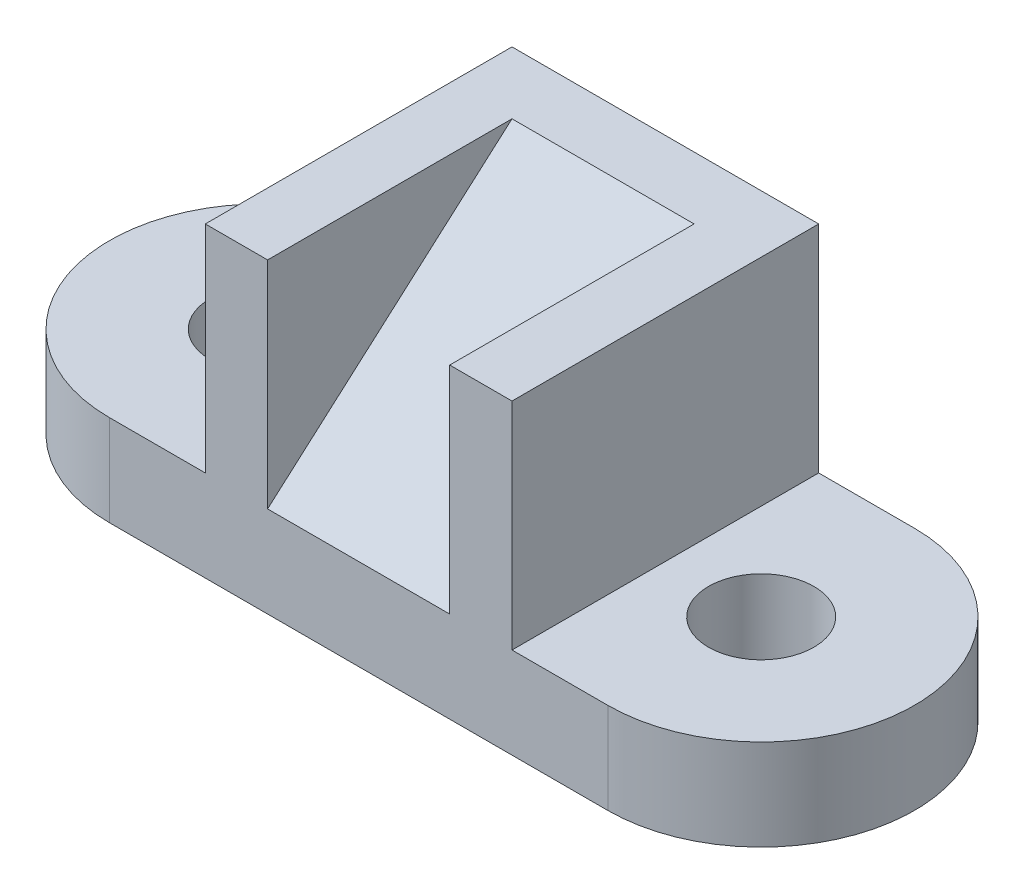
ISO-10303-21;
HEADER;
FILE_DESCRIPTION(('STEP AP214'),'2;1');
FILE_NAME('part.step','',(''),(''),'','','');
FILE_SCHEMA(('AUTOMOTIVE_DESIGN { 1 0 10303 214 1 1 1 1 }'));
ENDSEC;
DATA;
#1=APPLICATION_CONTEXT('core data for automotive mechanical design processes');
#2=APPLICATION_PROTOCOL_DEFINITION('international standard','automotive_design',2000,#1);
#3=PRODUCT_CONTEXT('',#1,'mechanical');
#4=PRODUCT('Part','Part','',(#3));
#5=PRODUCT_RELATED_PRODUCT_CATEGORY('part','',(#4));
#6=PRODUCT_DEFINITION_FORMATION('','',#4);
#7=PRODUCT_DEFINITION_CONTEXT('part definition',#1,'design');
#8=PRODUCT_DEFINITION('design','',#6,#7);
#9=PRODUCT_DEFINITION_SHAPE('','',#8);
#10=(LENGTH_UNIT() NAMED_UNIT(*) SI_UNIT(.MILLI.,.METRE.));
#11=(NAMED_UNIT(*) PLANE_ANGLE_UNIT() SI_UNIT($,.RADIAN.));
#12=(NAMED_UNIT(*) SI_UNIT($,.STERADIAN.) SOLID_ANGLE_UNIT());
#13=UNCERTAINTY_MEASURE_WITH_UNIT(LENGTH_MEASURE(1.E-05),#10,'distance_accuracy_value','');
#14=(GEOMETRIC_REPRESENTATION_CONTEXT(3) GLOBAL_UNCERTAINTY_ASSIGNED_CONTEXT((#13)) GLOBAL_UNIT_ASSIGNED_CONTEXT((#10,
#11,#12)) REPRESENTATION_CONTEXT('',''));
#15=CARTESIAN_POINT('',(0.,0.,0.));
#16=DIRECTION('',(0.,0.,1.));
#17=DIRECTION('',(1.,0.,0.));
#18=AXIS2_PLACEMENT_3D('',#15,#16,#17);
#19=CARTESIAN_POINT('',(33.,64.,0.));
#20=DIRECTION('',(-1.,0.,0.));
#21=DIRECTION('',(0.,0.,1.));
#22=AXIS2_PLACEMENT_3D('',#19,#20,#21);
#23=PLANE('',#22);
#24=DIRECTION('',(0.,-0.661621637086846,0.749837855365093));
#25=VECTOR('',#24,1.);
#26=CARTESIAN_POINT('',(33.,64.,-51.));
#27=LINE('',#26,#25);
#28=CARTESIAN_POINT('',(33.,64.,-51.));
#29=VERTEX_POINT('',#28);
#30=CARTESIAN_POINT('',(33.,19.,0.));
#31=VERTEX_POINT('',#30);
#32=EDGE_CURVE('E122',#29,#31,#27,.T.);
#33=ORIENTED_EDGE('',*,*,#32,.F.);
#34=DIRECTION('',(0.,0.,-1.));
#35=VECTOR('',#34,1.);
#36=CARTESIAN_POINT('',(33.,64.,0.));
#37=LINE('',#36,#35);
#38=CARTESIAN_POINT('',(33.,64.,0.));
#39=VERTEX_POINT('',#38);
#40=EDGE_CURVE('E230',#39,#29,#37,.T.);
#41=ORIENTED_EDGE('',*,*,#40,.F.);
#42=DIRECTION('',(0.,-1.,0.));
#43=VECTOR('',#42,1.);
#44=CARTESIAN_POINT('',(33.,64.,0.));
#45=LINE('',#44,#43);
#46=EDGE_CURVE('E141',#39,#31,#45,.T.);
#47=ORIENTED_EDGE('',*,*,#46,.T.);
#48=EDGE_LOOP('',(#33,#41,#47));
#49=FACE_BOUND('',#48,.T.);
#50=ADVANCED_FACE('F35',(#49),#23,.F.);
#51=CARTESIAN_POINT('',(71.,64.,0.));
#52=DIRECTION('',(1.,0.,0.));
#53=DIRECTION('',(0.,0.,-1.));
#54=AXIS2_PLACEMENT_3D('',#51,#52,#53);
#55=PLANE('',#54);
#56=DIRECTION('',(0.,-0.661621637086846,0.749837855365093));
#57=VECTOR('',#56,1.);
#58=CARTESIAN_POINT('',(71.,64.,-51.));
#59=LINE('',#58,#57);
#60=CARTESIAN_POINT('',(71.,64.,-51.));
#61=VERTEX_POINT('',#60);
#62=CARTESIAN_POINT('',(71.,19.,0.));
#63=VERTEX_POINT('',#62);
#64=EDGE_CURVE('E119',#61,#63,#59,.T.);
#65=ORIENTED_EDGE('',*,*,#64,.T.);
#66=DIRECTION('',(0.,-1.,0.));
#67=VECTOR('',#66,1.);
#68=CARTESIAN_POINT('',(71.,64.,0.));
#69=LINE('',#68,#67);
#70=CARTESIAN_POINT('',(71.,64.,0.));
#71=VERTEX_POINT('',#70);
#72=EDGE_CURVE('E133',#71,#63,#69,.T.);
#73=ORIENTED_EDGE('',*,*,#72,.F.);
#74=DIRECTION('',(0.,0.,1.));
#75=VECTOR('',#74,1.);
#76=CARTESIAN_POINT('',(71.,64.,0.));
#77=LINE('',#76,#75);
#78=EDGE_CURVE('E135',#61,#71,#77,.T.);
#79=ORIENTED_EDGE('',*,*,#78,.F.);
#80=EDGE_LOOP('',(#65,#73,#79));
#81=FACE_BOUND('',#80,.T.);
#82=ADVANCED_FACE('F132',(#81),#55,.F.);
#83=CARTESIAN_POINT('',(0.,19.,0.));
#84=DIRECTION('',(0.,1.,0.));
#85=DIRECTION('',(0.,0.,1.));
#86=AXIS2_PLACEMENT_3D('',#83,#84,#85);
#87=PLANE('',#86);
#88=DIRECTION('',(0.,0.,1.));
#89=VECTOR('',#88,1.);
#90=CARTESIAN_POINT('',(20.,19.,0.));
#91=LINE('',#90,#89);
#92=CARTESIAN_POINT('',(20.,19.,-64.));
#93=VERTEX_POINT('',#92);
#94=CARTESIAN_POINT('',(20.,19.,0.));
#95=VERTEX_POINT('',#94);
#96=EDGE_CURVE('E148',#93,#95,#91,.T.);
#97=ORIENTED_EDGE('',*,*,#96,.F.);
#98=DIRECTION('',(1.,0.,0.));
#99=VECTOR('',#98,1.);
#100=CARTESIAN_POINT('',(0.,19.,-64.));
#101=LINE('',#100,#99);
#102=CARTESIAN_POINT('',(0.,19.,-64.));
#103=VERTEX_POINT('',#102);
#104=EDGE_CURVE('E168',#103,#93,#101,.T.);
#105=ORIENTED_EDGE('',*,*,#104,.F.);
#106=CARTESIAN_POINT('',(0.,19.,-32.));
#107=DIRECTION('',(0.,1.,0.));
#108=DIRECTION('',(0.,0.,1.));
#109=AXIS2_PLACEMENT_3D('',#106,#107,#108);
#110=CIRCLE('',#109,32.);
#111=CARTESIAN_POINT('',(0.,19.,0.));
#112=VERTEX_POINT('',#111);
#113=EDGE_CURVE('E171',#103,#112,#110,.T.);
#114=ORIENTED_EDGE('',*,*,#113,.T.);
#115=DIRECTION('',(1.,0.,0.));
#116=VECTOR('',#115,1.);
#117=CARTESIAN_POINT('',(0.,19.,0.));
#118=LINE('',#117,#116);
#119=EDGE_CURVE('E58',#112,#95,#118,.T.);
#120=ORIENTED_EDGE('',*,*,#119,.T.);
#121=EDGE_LOOP('',(#97,#105,#114,#120));
#122=FACE_BOUND('',#121,.T.);
#123=CARTESIAN_POINT('',(0.,19.,-32.));
#124=DIRECTION('',(0.,1.,0.));
#125=DIRECTION('',(0.,0.,1.));
#126=AXIS2_PLACEMENT_3D('',#123,#124,#125);
#127=CIRCLE('',#126,11.);
#128=CARTESIAN_POINT('',(0.,19.,-21.));
#129=VERTEX_POINT('',#128);
#130=EDGE_CURVE('E176',#129,#129,#127,.T.);
#131=ORIENTED_EDGE('',*,*,#130,.F.);
#132=EDGE_LOOP('',(#131));
#133=FACE_BOUND('',#132,.T.);
#134=ADVANCED_FACE('F242',(#122,#133),#87,.T.);
#135=CARTESIAN_POINT('',(104.,19.,-32.));
#136=DIRECTION('',(0.,-1.,0.));
#137=DIRECTION('',(0.,0.,-1.));
#138=AXIS2_PLACEMENT_3D('',#135,#136,#137);
#139=CYLINDRICAL_SURFACE('',#138,32.);
#140=CARTESIAN_POINT('',(104.,0.,-32.));
#141=DIRECTION('',(0.,1.,0.));
#142=DIRECTION('',(0.,0.,1.));
#143=AXIS2_PLACEMENT_3D('',#140,#141,#142);
#144=CIRCLE('',#143,32.);
#145=CARTESIAN_POINT('',(104.,0.,0.));
#146=VERTEX_POINT('',#145);
#147=CARTESIAN_POINT('',(104.,0.,-64.));
#148=VERTEX_POINT('',#147);
#149=EDGE_CURVE('E162',#146,#148,#144,.T.);
#150=ORIENTED_EDGE('',*,*,#149,.T.);
#151=DIRECTION('',(0.,-1.,0.));
#152=VECTOR('',#151,1.);
#153=CARTESIAN_POINT('',(104.,19.,-64.));
#154=LINE('',#153,#152);
#155=CARTESIAN_POINT('',(104.,19.,-64.));
#156=VERTEX_POINT('',#155);
#157=EDGE_CURVE('E11',#156,#148,#154,.T.);
#158=ORIENTED_EDGE('',*,*,#157,.F.);
#159=CARTESIAN_POINT('',(104.,19.,-32.));
#160=DIRECTION('',(0.,1.,0.));
#161=DIRECTION('',(0.,0.,1.));
#162=AXIS2_PLACEMENT_3D('',#159,#160,#161);
#163=CIRCLE('',#162,32.);
#164=CARTESIAN_POINT('',(104.,19.,0.));
#165=VERTEX_POINT('',#164);
#166=EDGE_CURVE('E163',#165,#156,#163,.T.);
#167=ORIENTED_EDGE('',*,*,#166,.F.);
#168=DIRECTION('',(0.,-1.,0.));
#169=VECTOR('',#168,1.);
#170=CARTESIAN_POINT('',(104.,19.,0.));
#171=LINE('',#170,#169);
#172=EDGE_CURVE('E179',#165,#146,#171,.T.);
#173=ORIENTED_EDGE('',*,*,#172,.T.);
#174=EDGE_LOOP('',(#150,#158,#167,#173));
#175=FACE_BOUND('',#174,.T.);
#176=ADVANCED_FACE('F37',(#175),#139,.T.);
#177=CARTESIAN_POINT('',(0.,19.,-64.));
#178=DIRECTION('',(0.,0.,-1.));
#179=DIRECTION('',(-1.,0.,0.));
#180=AXIS2_PLACEMENT_3D('',#177,#178,#179);
#181=PLANE('',#180);
#182=DIRECTION('',(1.,0.,0.));
#183=VECTOR('',#182,1.);
#184=CARTESIAN_POINT('',(0.,0.,-64.));
#185=LINE('',#184,#183);
#186=CARTESIAN_POINT('',(0.,0.,-64.));
#187=VERTEX_POINT('',#186);
#188=EDGE_CURVE('E182',#187,#148,#185,.T.);
#189=ORIENTED_EDGE('',*,*,#188,.F.);
#190=DIRECTION('',(0.,-1.,0.));
#191=VECTOR('',#190,1.);
#192=CARTESIAN_POINT('',(0.,19.,-64.));
#193=LINE('',#192,#191);
#194=EDGE_CURVE('E43',#103,#187,#193,.T.);
#195=ORIENTED_EDGE('',*,*,#194,.F.);
#196=ORIENTED_EDGE('',*,*,#104,.T.);
#197=DIRECTION('',(0.,-1.,0.));
#198=VECTOR('',#197,1.);
#199=CARTESIAN_POINT('',(20.,64.,-64.));
#200=LINE('',#199,#198);
#201=CARTESIAN_POINT('',(20.,64.,-64.));
#202=VERTEX_POINT('',#201);
#203=EDGE_CURVE('E153',#202,#93,#200,.T.);
#204=ORIENTED_EDGE('',*,*,#203,.F.);
#205=DIRECTION('',(-1.,0.,0.));
#206=VECTOR('',#205,1.);
#207=CARTESIAN_POINT('',(84.,64.,-64.));
#208=LINE('',#207,#206);
#209=CARTESIAN_POINT('',(84.,64.,-64.));
#210=VERTEX_POINT('',#209);
#211=EDGE_CURVE('E235',#210,#202,#208,.T.);
#212=ORIENTED_EDGE('',*,*,#211,.F.);
#213=DIRECTION('',(0.,-1.,0.));
#214=VECTOR('',#213,1.);
#215=CARTESIAN_POINT('',(84.,64.,-64.));
#216=LINE('',#215,#214);
#217=CARTESIAN_POINT('',(84.,19.,-64.));
#218=VERTEX_POINT('',#217);
#219=EDGE_CURVE('E156',#210,#218,#216,.T.);
#220=ORIENTED_EDGE('',*,*,#219,.T.);
#221=EDGE_CURVE('E166',#218,#156,#101,.T.);
#222=ORIENTED_EDGE('',*,*,#221,.T.);
#223=ORIENTED_EDGE('',*,*,#157,.T.);
#224=EDGE_LOOP('',(#189,#195,#196,#204,#212,#220,#222,#223));
#225=FACE_BOUND('',#224,.T.);
#226=ADVANCED_FACE('F211',(#225),#181,.T.);
#227=CARTESIAN_POINT('',(0.,19.,-32.));
#228=DIRECTION('',(0.,-1.,0.));
#229=DIRECTION('',(0.,0.,-1.));
#230=AXIS2_PLACEMENT_3D('',#227,#228,#229);
#231=CYLINDRICAL_SURFACE('',#230,32.);
#232=CARTESIAN_POINT('',(0.,0.,-32.));
#233=DIRECTION('',(0.,1.,0.));
#234=DIRECTION('',(0.,0.,1.));
#235=AXIS2_PLACEMENT_3D('',#232,#233,#234);
#236=CIRCLE('',#235,32.);
#237=CARTESIAN_POINT('',(0.,0.,0.));
#238=VERTEX_POINT('',#237);
#239=EDGE_CURVE('E185',#187,#238,#236,.T.);
#240=ORIENTED_EDGE('',*,*,#239,.T.);
#241=DIRECTION('',(0.,-1.,0.));
#242=VECTOR('',#241,1.);
#243=CARTESIAN_POINT('',(0.,19.,0.));
#244=LINE('',#243,#242);
#245=EDGE_CURVE('E196',#112,#238,#244,.T.);
#246=ORIENTED_EDGE('',*,*,#245,.F.);
#247=ORIENTED_EDGE('',*,*,#113,.F.);
#248=ORIENTED_EDGE('',*,*,#194,.T.);
#249=EDGE_LOOP('',(#240,#246,#247,#248));
#250=FACE_BOUND('',#249,.T.);
#251=ADVANCED_FACE('F201',(#250),#231,.T.);
#252=CARTESIAN_POINT('',(104.,19.,-32.));
#253=DIRECTION('',(0.,-1.,0.));
#254=DIRECTION('',(0.,0.,-1.));
#255=AXIS2_PLACEMENT_3D('',#252,#253,#254);
#256=CYLINDRICAL_SURFACE('',#255,11.);
#257=CARTESIAN_POINT('',(104.,19.,-32.));
#258=DIRECTION('',(0.,1.,0.));
#259=DIRECTION('',(0.,0.,1.));
#260=AXIS2_PLACEMENT_3D('',#257,#258,#259);
#261=CIRCLE('',#260,11.);
#262=CARTESIAN_POINT('',(104.,19.,-21.));
#263=VERTEX_POINT('',#262);
#264=EDGE_CURVE('E173',#263,#263,#261,.T.);
#265=ORIENTED_EDGE('',*,*,#264,.T.);
#266=EDGE_LOOP('',(#265));
#267=FACE_BOUND('',#266,.T.);
#268=CARTESIAN_POINT('',(104.,0.,-32.));
#269=DIRECTION('',(0.,1.,0.));
#270=DIRECTION('',(0.,0.,1.));
#271=AXIS2_PLACEMENT_3D('',#268,#269,#270);
#272=CIRCLE('',#271,11.);
#273=CARTESIAN_POINT('',(104.,0.,-21.));
#274=VERTEX_POINT('',#273);
#275=EDGE_CURVE('E189',#274,#274,#272,.T.);
#276=ORIENTED_EDGE('',*,*,#275,.F.);
#277=EDGE_LOOP('',(#276));
#278=FACE_BOUND('',#277,.T.);
#279=ADVANCED_FACE('F297',(#267,#278),#256,.F.);
#280=CARTESIAN_POINT('',(0.,19.,0.));
#281=DIRECTION('',(0.,0.,-1.));
#282=DIRECTION('',(-1.,0.,0.));
#283=AXIS2_PLACEMENT_3D('',#280,#281,#282);
#284=PLANE('',#283);
#285=DIRECTION('',(1.,0.,0.));
#286=VECTOR('',#285,1.);
#287=CARTESIAN_POINT('',(0.,0.,0.));
#288=LINE('',#287,#286);
#289=EDGE_CURVE('E187',#238,#146,#288,.T.);
#290=ORIENTED_EDGE('',*,*,#289,.T.);
#291=ORIENTED_EDGE('',*,*,#172,.F.);
#292=CARTESIAN_POINT('',(84.,19.,0.));
#293=VERTEX_POINT('',#292);
#294=EDGE_CURVE('E127',#293,#165,#118,.T.);
#295=ORIENTED_EDGE('',*,*,#294,.F.);
#296=DIRECTION('',(0.,-1.,0.));
#297=VECTOR('',#296,1.);
#298=CARTESIAN_POINT('',(84.,64.,0.));
#299=LINE('',#298,#297);
#300=CARTESIAN_POINT('',(84.,64.,0.));
#301=VERTEX_POINT('',#300);
#302=EDGE_CURVE('E159',#301,#293,#299,.T.);
#303=ORIENTED_EDGE('',*,*,#302,.F.);
#304=DIRECTION('',(1.,0.,0.));
#305=VECTOR('',#304,1.);
#306=CARTESIAN_POINT('',(84.,64.,0.));
#307=LINE('',#306,#305);
#308=EDGE_CURVE('E140',#71,#301,#307,.T.);
#309=ORIENTED_EDGE('',*,*,#308,.F.);
#310=ORIENTED_EDGE('',*,*,#72,.T.);
#311=EDGE_CURVE('E116',#31,#63,#118,.T.);
#312=ORIENTED_EDGE('',*,*,#311,.F.);
#313=ORIENTED_EDGE('',*,*,#46,.F.);
#314=DIRECTION('',(1.,0.,0.));
#315=VECTOR('',#314,1.);
#316=CARTESIAN_POINT('',(20.,64.,0.));
#317=LINE('',#316,#315);
#318=CARTESIAN_POINT('',(20.,64.,0.));
#319=VERTEX_POINT('',#318);
#320=EDGE_CURVE('E218',#319,#39,#317,.T.);
#321=ORIENTED_EDGE('',*,*,#320,.F.);
#322=DIRECTION('',(0.,-1.,0.));
#323=VECTOR('',#322,1.);
#324=CARTESIAN_POINT('',(20.,64.,0.));
#325=LINE('',#324,#323);
#326=EDGE_CURVE('E143',#319,#95,#325,.T.);
#327=ORIENTED_EDGE('',*,*,#326,.T.);
#328=ORIENTED_EDGE('',*,*,#119,.F.);
#329=ORIENTED_EDGE('',*,*,#245,.T.);
#330=EDGE_LOOP('',(#290,#291,#295,#303,#309,#310,#312,#313,#321,#327,#328,#329));
#331=FACE_BOUND('',#330,.T.);
#332=ADVANCED_FACE('F137',(#331),#284,.F.);
#333=CARTESIAN_POINT('',(0.,19.,-32.));
#334=DIRECTION('',(0.,-1.,0.));
#335=DIRECTION('',(0.,0.,-1.));
#336=AXIS2_PLACEMENT_3D('',#333,#334,#335);
#337=CYLINDRICAL_SURFACE('',#336,11.);
#338=ORIENTED_EDGE('',*,*,#130,.T.);
#339=EDGE_LOOP('',(#338));
#340=FACE_BOUND('',#339,.T.);
#341=CARTESIAN_POINT('',(0.,0.,-32.));
#342=DIRECTION('',(0.,1.,0.));
#343=DIRECTION('',(0.,0.,1.));
#344=AXIS2_PLACEMENT_3D('',#341,#342,#343);
#345=CIRCLE('',#344,11.);
#346=CARTESIAN_POINT('',(0.,0.,-21.));
#347=VERTEX_POINT('',#346);
#348=EDGE_CURVE('E167',#347,#347,#345,.T.);
#349=ORIENTED_EDGE('',*,*,#348,.F.);
#350=EDGE_LOOP('',(#349));
#351=FACE_BOUND('',#350,.T.);
#352=ADVANCED_FACE('F249',(#340,#351),#337,.F.);
#353=DIRECTION('',(0.,0.,-1.));
#354=VECTOR('',#353,1.);
#355=CARTESIAN_POINT('',(84.,19.,0.));
#356=LINE('',#355,#354);
#357=EDGE_CURVE('E50',#293,#218,#356,.T.);
#358=ORIENTED_EDGE('',*,*,#357,.F.);
#359=ORIENTED_EDGE('',*,*,#294,.T.);
#360=ORIENTED_EDGE('',*,*,#166,.T.);
#361=ORIENTED_EDGE('',*,*,#221,.F.);
#362=EDGE_LOOP('',(#358,#359,#360,#361));
#363=FACE_BOUND('',#362,.T.);
#364=ORIENTED_EDGE('',*,*,#264,.F.);
#365=EDGE_LOOP('',(#364));
#366=FACE_BOUND('',#365,.T.);
#367=ADVANCED_FACE('F246',(#363,#366),#87,.T.);
#368=CARTESIAN_POINT('',(0.,0.,0.));
#369=DIRECTION('',(0.,1.,0.));
#370=DIRECTION('',(0.,0.,1.));
#371=AXIS2_PLACEMENT_3D('',#368,#369,#370);
#372=PLANE('',#371);
#373=ORIENTED_EDGE('',*,*,#149,.F.);
#374=ORIENTED_EDGE('',*,*,#289,.F.);
#375=ORIENTED_EDGE('',*,*,#239,.F.);
#376=ORIENTED_EDGE('',*,*,#188,.T.);
#377=EDGE_LOOP('',(#373,#374,#375,#376));
#378=FACE_BOUND('',#377,.T.);
#379=ORIENTED_EDGE('',*,*,#275,.T.);
#380=EDGE_LOOP('',(#379));
#381=FACE_BOUND('',#380,.T.);
#382=ORIENTED_EDGE('',*,*,#348,.T.);
#383=EDGE_LOOP('',(#382));
#384=FACE_BOUND('',#383,.T.);
#385=ADVANCED_FACE('F209',(#378,#381,#384),#372,.F.);
#386=CARTESIAN_POINT('',(84.,64.,0.));
#387=DIRECTION('',(-1.,0.,0.));
#388=DIRECTION('',(0.,0.,1.));
#389=AXIS2_PLACEMENT_3D('',#386,#387,#388);
#390=PLANE('',#389);
#391=ORIENTED_EDGE('',*,*,#357,.T.);
#392=ORIENTED_EDGE('',*,*,#219,.F.);
#393=DIRECTION('',(0.,0.,-1.));
#394=VECTOR('',#393,1.);
#395=CARTESIAN_POINT('',(84.,64.,0.));
#396=LINE('',#395,#394);
#397=EDGE_CURVE('E224',#301,#210,#396,.T.);
#398=ORIENTED_EDGE('',*,*,#397,.F.);
#399=ORIENTED_EDGE('',*,*,#302,.T.);
#400=EDGE_LOOP('',(#391,#392,#398,#399));
#401=FACE_BOUND('',#400,.T.);
#402=ADVANCED_FACE('F241',(#401),#390,.F.);
#403=CARTESIAN_POINT('',(20.,64.,0.));
#404=DIRECTION('',(1.,0.,0.));
#405=DIRECTION('',(0.,0.,-1.));
#406=AXIS2_PLACEMENT_3D('',#403,#404,#405);
#407=PLANE('',#406);
#408=ORIENTED_EDGE('',*,*,#96,.T.);
#409=ORIENTED_EDGE('',*,*,#326,.F.);
#410=DIRECTION('',(0.,0.,1.));
#411=VECTOR('',#410,1.);
#412=CARTESIAN_POINT('',(20.,64.,0.));
#413=LINE('',#412,#411);
#414=EDGE_CURVE('E222',#202,#319,#413,.T.);
#415=ORIENTED_EDGE('',*,*,#414,.F.);
#416=ORIENTED_EDGE('',*,*,#203,.T.);
#417=EDGE_LOOP('',(#408,#409,#415,#416));
#418=FACE_BOUND('',#417,.T.);
#419=ADVANCED_FACE('F221',(#418),#407,.F.);
#420=CARTESIAN_POINT('',(0.,64.,0.));
#421=DIRECTION('',(0.,-1.,0.));
#422=DIRECTION('',(0.,0.,-1.));
#423=AXIS2_PLACEMENT_3D('',#420,#421,#422);
#424=PLANE('',#423);
#425=ORIENTED_EDGE('',*,*,#308,.T.);
#426=ORIENTED_EDGE('',*,*,#397,.T.);
#427=ORIENTED_EDGE('',*,*,#211,.T.);
#428=ORIENTED_EDGE('',*,*,#414,.T.);
#429=ORIENTED_EDGE('',*,*,#320,.T.);
#430=ORIENTED_EDGE('',*,*,#40,.T.);
#431=DIRECTION('',(1.,0.,0.));
#432=VECTOR('',#431,1.);
#433=CARTESIAN_POINT('',(71.,64.,-51.));
#434=LINE('',#433,#432);
#435=EDGE_CURVE('E145',#29,#61,#434,.T.);
#436=ORIENTED_EDGE('',*,*,#435,.T.);
#437=ORIENTED_EDGE('',*,*,#78,.T.);
#438=EDGE_LOOP('',(#425,#426,#427,#428,#429,#430,#436,#437));
#439=FACE_BOUND('',#438,.T.);
#440=ADVANCED_FACE('F239',(#439),#424,.F.);
#441=CARTESIAN_POINT('',(71.,64.,-51.));
#442=DIRECTION('',(0.,-0.749837855365093,-0.661621637086846));
#443=DIRECTION('',(0.,0.661621637086846,-0.749837855365093));
#444=AXIS2_PLACEMENT_3D('',#441,#442,#443);
#445=PLANE('',#444);
#446=ORIENTED_EDGE('',*,*,#32,.T.);
#447=ORIENTED_EDGE('',*,*,#311,.T.);
#448=ORIENTED_EDGE('',*,*,#64,.F.);
#449=ORIENTED_EDGE('',*,*,#435,.F.);
#450=EDGE_LOOP('',(#446,#447,#448,#449));
#451=FACE_BOUND('',#450,.T.);
#452=ADVANCED_FACE('F118',(#451),#445,.F.);
#453=CLOSED_SHELL('',(#50,#82,#134,#176,#226,#251,#279,#332,#352,#367,#385,#402,#419,#440,#452));
#454=MANIFOLD_SOLID_BREP('B2',#453);
#455=ADVANCED_BREP_SHAPE_REPRESENTATION('',(#18,#454),#14);
#456=SHAPE_DEFINITION_REPRESENTATION(#9,#455);
ENDSEC;
END-ISO-10303-21;
